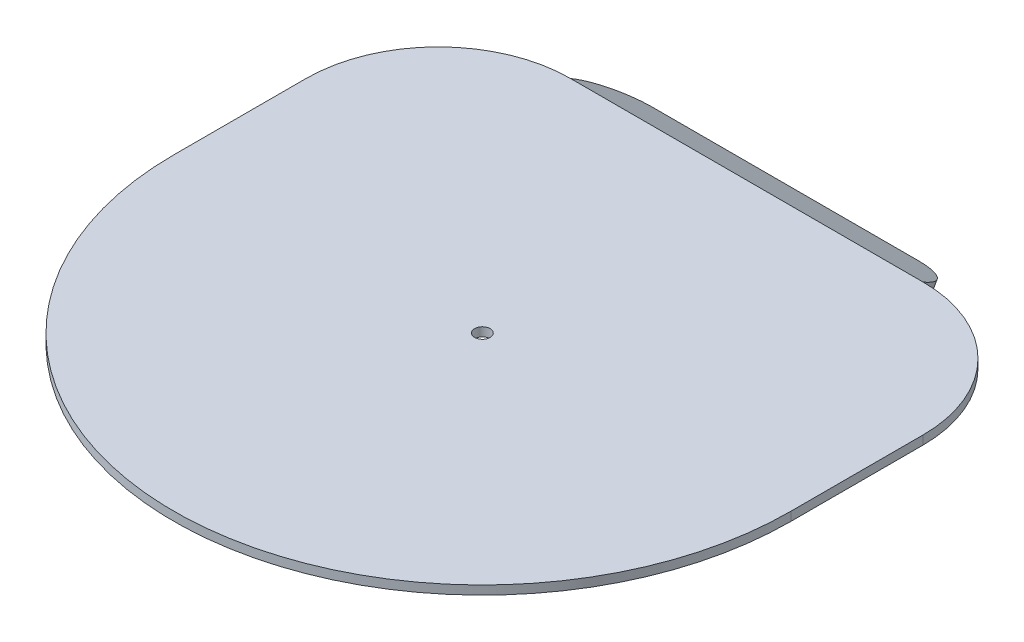
ISO-10303-21;
HEADER;
FILE_DESCRIPTION(('STEP AP214'),'2;1');
FILE_NAME('part.step','',(''),(''),'','','');
FILE_SCHEMA(('AUTOMOTIVE_DESIGN { 1 0 10303 214 1 1 1 1 }'));
ENDSEC;
DATA;
#1=APPLICATION_CONTEXT('core data for automotive mechanical design processes');
#2=APPLICATION_PROTOCOL_DEFINITION('international standard','automotive_design',2000,#1);
#3=PRODUCT_CONTEXT('',#1,'mechanical');
#4=PRODUCT('Part','Part','',(#3));
#5=PRODUCT_RELATED_PRODUCT_CATEGORY('part','',(#4));
#6=PRODUCT_DEFINITION_FORMATION('','',#4);
#7=PRODUCT_DEFINITION_CONTEXT('part definition',#1,'design');
#8=PRODUCT_DEFINITION('design','',#6,#7);
#9=PRODUCT_DEFINITION_SHAPE('','',#8);
#10=(LENGTH_UNIT() NAMED_UNIT(*) SI_UNIT(.MILLI.,.METRE.));
#11=(NAMED_UNIT(*) PLANE_ANGLE_UNIT() SI_UNIT($,.RADIAN.));
#12=(NAMED_UNIT(*) SI_UNIT($,.STERADIAN.) SOLID_ANGLE_UNIT());
#13=UNCERTAINTY_MEASURE_WITH_UNIT(LENGTH_MEASURE(1.E-05),#10,'distance_accuracy_value','');
#14=(GEOMETRIC_REPRESENTATION_CONTEXT(3) GLOBAL_UNCERTAINTY_ASSIGNED_CONTEXT((#13)) GLOBAL_UNIT_ASSIGNED_CONTEXT((#10,
#11,#12)) REPRESENTATION_CONTEXT('',''));
#15=CARTESIAN_POINT('',(0.,0.,0.));
#16=DIRECTION('',(0.,0.,1.));
#17=DIRECTION('',(1.,0.,0.));
#18=AXIS2_PLACEMENT_3D('',#15,#16,#17);
#19=CARTESIAN_POINT('',(40.,2.,-30.));
#20=DIRECTION('',(0.,-1.,0.));
#21=DIRECTION('',(0.,0.,-1.));
#22=AXIS2_PLACEMENT_3D('',#19,#20,#21);
#23=CYLINDRICAL_SURFACE('',#22,30.);
#24=CARTESIAN_POINT('',(40.,0.,-30.));
#25=DIRECTION('',(0.,1.,0.));
#26=DIRECTION('',(0.,0.,-1.));
#27=AXIS2_PLACEMENT_3D('',#24,#25,#26);
#28=CIRCLE('',#27,30.);
#29=CARTESIAN_POINT('',(70.,0.,-30.));
#30=VERTEX_POINT('',#29);
#31=CARTESIAN_POINT('',(39.9498780153371,0.,-59.9999581297483));
#32=VERTEX_POINT('',#31);
#33=EDGE_CURVE('E60',#30,#32,#28,.T.);
#34=ORIENTED_EDGE('',*,*,#33,.T.);
#35=CARTESIAN_POINT('',(40.,1.99999999999999,-60.));
#36=CARTESIAN_POINT('',(39.999961506515,1.47854525931197,-59.9999769553019));
#37=CARTESIAN_POINT('',(39.9898025800449,0.957077808216858,-59.9999990153782));
#38=CARTESIAN_POINT('',(39.9489528441156,-0.0850911635174333,-59.9999697292118));
#39=CARTESIAN_POINT('',(39.9182604228085,-0.605792620811148,-59.999918377206));
#40=CARTESIAN_POINT('',(39.8363586974328,-1.64168453915047,-59.9995798683968));
#41=CARTESIAN_POINT('',(39.7853038854251,-2.15688716354821,-59.9992944704875));
#42=CARTESIAN_POINT('',(39.6621603296286,-3.18478581978548,-59.9981613441634));
#43=CARTESIAN_POINT('',(39.5900714052798,-3.69748183006945,-59.9973136109215));
#44=CARTESIAN_POINT('',(39.4241683640519,-4.71955823831024,-59.9945881490656));
#45=CARTESIAN_POINT('',(39.3303459966717,-5.22893730138839,-59.9927100289224));
#46=CARTESIAN_POINT('',(39.1202008636507,-6.24299037621144,-59.987279925922));
#47=CARTESIAN_POINT('',(39.0038800968857,-6.74766480176884,-59.9837280917261));
#48=CARTESIAN_POINT('',(38.7468753192189,-7.75478168683857,-59.9740979430176));
#49=CARTESIAN_POINT('',(38.6060165503674,-8.25717963330026,-59.9680010352913));
#50=CARTESIAN_POINT('',(38.2994645253832,-9.25445145679135,-59.9521454286119));
#51=CARTESIAN_POINT('',(38.1337629998013,-9.74932276777176,-59.9423855087136));
#52=CARTESIAN_POINT('',(37.955149640235,-10.2395263632546,-59.9302286494134));
#53=B_SPLINE_CURVE_WITH_KNOTS('',3,(#35,#36,#37,#38,#39,#40,#41,#42,#43,#44,#45,#46,#47,#48,#49,
#50,#51,#52),.UNSPECIFIED.,.F.,.F.,(4,2,2,2,2,2,2,2,4),(0.,1.56428596623622,3.12869474094047,
4.68145331124496,6.23422521105292,7.78758754664726,9.34081193672361,10.9055877996525,
12.4708856933261),.UNSPECIFIED.);
#54=CARTESIAN_POINT('',(40.,2.,-60.));
#55=VERTEX_POINT('',#54);
#56=EDGE_CURVE('E11',#32,#55,#53,.F.);
#57=ORIENTED_EDGE('',*,*,#56,.T.);
#58=CARTESIAN_POINT('',(40.,2.,-30.));
#59=DIRECTION('',(0.,1.,0.));
#60=DIRECTION('',(0.,0.,-1.));
#61=AXIS2_PLACEMENT_3D('',#58,#59,#60);
#62=CIRCLE('',#61,30.);
#63=CARTESIAN_POINT('',(70.,2.,-30.));
#64=VERTEX_POINT('',#63);
#65=EDGE_CURVE('E117',#64,#55,#62,.T.);
#66=ORIENTED_EDGE('',*,*,#65,.F.);
#67=DIRECTION('',(0.,-1.,0.));
#68=VECTOR('',#67,1.);
#69=CARTESIAN_POINT('',(70.,2.,-30.));
#70=LINE('',#69,#68);
#71=EDGE_CURVE('E226',#64,#30,#70,.T.);
#72=ORIENTED_EDGE('',*,*,#71,.T.);
#73=EDGE_LOOP('',(#34,#57,#66,#72));
#74=FACE_BOUND('',#73,.T.);
#75=ADVANCED_FACE('F43',(#74),#23,.T.);
#76=CARTESIAN_POINT('',(-40.,2.,-30.));
#77=DIRECTION('',(0.,-1.,0.));
#78=DIRECTION('',(0.,0.,-1.));
#79=AXIS2_PLACEMENT_3D('',#76,#77,#78);
#80=CYLINDRICAL_SURFACE('',#79,30.);
#81=CARTESIAN_POINT('',(-40.,0.,-30.));
#82=DIRECTION('',(0.,1.,0.));
#83=DIRECTION('',(0.,0.,-1.));
#84=AXIS2_PLACEMENT_3D('',#81,#82,#83);
#85=CIRCLE('',#84,30.);
#86=CARTESIAN_POINT('',(-39.9498780153371,0.,-59.9999581297483));
#87=VERTEX_POINT('',#86);
#88=CARTESIAN_POINT('',(-70.,0.,-30.));
#89=VERTEX_POINT('',#88);
#90=EDGE_CURVE('E68',#87,#89,#85,.T.);
#91=ORIENTED_EDGE('',*,*,#90,.T.);
#92=DIRECTION('',(0.,-1.,0.));
#93=VECTOR('',#92,1.);
#94=CARTESIAN_POINT('',(-70.,2.,-30.));
#95=LINE('',#94,#93);
#96=CARTESIAN_POINT('',(-70.,2.,-30.));
#97=VERTEX_POINT('',#96);
#98=EDGE_CURVE('E248',#97,#89,#95,.T.);
#99=ORIENTED_EDGE('',*,*,#98,.F.);
#100=CARTESIAN_POINT('',(-40.,2.,-30.));
#101=DIRECTION('',(0.,1.,0.));
#102=DIRECTION('',(0.,0.,-1.));
#103=AXIS2_PLACEMENT_3D('',#100,#101,#102);
#104=CIRCLE('',#103,30.);
#105=CARTESIAN_POINT('',(-40.,2.,-60.));
#106=VERTEX_POINT('',#105);
#107=EDGE_CURVE('E133',#106,#97,#104,.T.);
#108=ORIENTED_EDGE('',*,*,#107,.F.);
#109=CARTESIAN_POINT('',(-39.9498780153371,0.,-59.9999581297483));
#110=CARTESIAN_POINT('',(-39.9631579032479,0.264356991248656,-59.9999792044114));
#111=CARTESIAN_POINT('',(-39.9737900293745,0.528839174662567,-59.9999894112579));
#112=CARTESIAN_POINT('',(-39.9897803427863,1.05796285693506,-59.9999995294392));
#113=CARTESIAN_POINT('',(-39.9951385329807,1.32260435570568,-59.9999994407798));
#114=CARTESIAN_POINT('',(-40.003334197164,2.11659318568166,-60.000000891643));
#115=CARTESIAN_POINT('',(-39.9982946888179,2.64604330456979,-60.0000041477448));
#116=CARTESIAN_POINT('',(-39.9672662152775,3.70032547567124,-59.9999859697698));
#117=CARTESIAN_POINT('',(-39.9414352708191,4.22516228392922,-59.9999647214084));
#118=CARTESIAN_POINT('',(-39.8686621584244,5.27342251730089,-59.9997347530244));
#119=CARTESIAN_POINT('',(-39.8217184648814,5.79684583752584,-59.9995260194529));
#120=CARTESIAN_POINT('',(-39.7059712961723,6.84153889892198,-59.9986149770913));
#121=CARTESIAN_POINT('',(-39.637156972602,7.36280744100263,-59.9979124231435));
#122=CARTESIAN_POINT('',(-39.4765065745418,8.4017377067457,-59.9955406169536));
#123=CARTESIAN_POINT('',(-39.3846747051033,8.91940007148219,-59.9938715412115));
#124=CARTESIAN_POINT('',(-39.2279090231018,9.69403810860744,-59.990108273214));
#125=CARTESIAN_POINT('',(-39.1722378425236,9.95291405274206,-59.9886359456599));
#126=CARTESIAN_POINT('',(-39.0542709773639,10.4691460309964,-59.9851477355492));
#127=CARTESIAN_POINT('',(-38.9919755411104,10.7265021217104,-59.9831318733641));
#128=CARTESIAN_POINT('',(-38.8603556759017,11.2395681494122,-59.9784184637259));
#129=CARTESIAN_POINT('',(-38.7910272207692,11.4952770533486,-59.9757205244719));
#130=CARTESIAN_POINT('',(-38.6448867327753,12.0045698003699,-59.9694666282306));
#131=CARTESIAN_POINT('',(-38.5680737289667,12.2581533630944,-59.9659105598322));
#132=CARTESIAN_POINT('',(-38.4872851586335,12.5104763735637,-59.9618372902716));
#133=B_SPLINE_CURVE_WITH_KNOTS('',3,(#109,#110,#111,#112,#113,#114,#115,#116,#117,#118,#119,
#120,#121,#122,#123,#124,#125,#126,#127,#128,#129,#130,#131,#132),.UNSPECIFIED.,.F.,.F.,(4,2,2,
2,2,2,2,2,2,2,2,4),(0.,0.794042414901446,1.58808439179831,3.17605292162782,4.75206513742107,
6.32819125410236,7.90510039390599,9.48172165953497,10.276045163004,11.0703388996105,
11.8650899376874,12.6599442139598),.UNSPECIFIED.);
#134=EDGE_CURVE('E161',#106,#87,#133,.F.);
#135=ORIENTED_EDGE('',*,*,#134,.T.);
#136=EDGE_LOOP('',(#91,#99,#108,#135));
#137=FACE_BOUND('',#136,.T.);
#138=ADVANCED_FACE('F174',(#137),#80,.T.);
#139=CARTESIAN_POINT('',(-70.,2.,0.));
#140=DIRECTION('',(1.,0.,0.));
#141=DIRECTION('',(0.,0.,-1.));
#142=AXIS2_PLACEMENT_3D('',#139,#140,#141);
#143=PLANE('',#142);
#144=DIRECTION('',(0.,0.,1.));
#145=VECTOR('',#144,1.);
#146=CARTESIAN_POINT('',(-70.,0.,0.));
#147=LINE('',#146,#145);
#148=CARTESIAN_POINT('',(-70.,0.,0.));
#149=VERTEX_POINT('',#148);
#150=EDGE_CURVE('E230',#89,#149,#147,.T.);
#151=ORIENTED_EDGE('',*,*,#150,.T.);
#152=DIRECTION('',(0.,-1.,0.));
#153=VECTOR('',#152,1.);
#154=CARTESIAN_POINT('',(-70.,2.,0.));
#155=LINE('',#154,#153);
#156=CARTESIAN_POINT('',(-70.,2.,0.));
#157=VERTEX_POINT('',#156);
#158=EDGE_CURVE('E244',#157,#149,#155,.T.);
#159=ORIENTED_EDGE('',*,*,#158,.F.);
#160=DIRECTION('',(0.,0.,1.));
#161=VECTOR('',#160,1.);
#162=CARTESIAN_POINT('',(-70.,2.,0.));
#163=LINE('',#162,#161);
#164=EDGE_CURVE('E219',#97,#157,#163,.T.);
#165=ORIENTED_EDGE('',*,*,#164,.F.);
#166=ORIENTED_EDGE('',*,*,#98,.T.);
#167=EDGE_LOOP('',(#151,#159,#165,#166));
#168=FACE_BOUND('',#167,.T.);
#169=ADVANCED_FACE('F178',(#168),#143,.F.);
#170=CARTESIAN_POINT('',(0.,2.,0.));
#171=DIRECTION('',(0.,-1.,0.));
#172=DIRECTION('',(0.,0.,-1.));
#173=AXIS2_PLACEMENT_3D('',#170,#171,#172);
#174=CYLINDRICAL_SURFACE('',#173,70.);
#175=CARTESIAN_POINT('',(0.,0.,0.));
#176=DIRECTION('',(0.,1.,0.));
#177=DIRECTION('',(0.,0.,1.));
#178=AXIS2_PLACEMENT_3D('',#175,#176,#177);
#179=CIRCLE('',#178,70.);
#180=CARTESIAN_POINT('',(70.,0.,0.));
#181=VERTEX_POINT('',#180);
#182=EDGE_CURVE('E233',#149,#181,#179,.T.);
#183=ORIENTED_EDGE('',*,*,#182,.T.);
#184=DIRECTION('',(0.,-1.,0.));
#185=VECTOR('',#184,1.);
#186=CARTESIAN_POINT('',(70.,2.,0.));
#187=LINE('',#186,#185);
#188=CARTESIAN_POINT('',(70.,2.,0.));
#189=VERTEX_POINT('',#188);
#190=EDGE_CURVE('E240',#189,#181,#187,.T.);
#191=ORIENTED_EDGE('',*,*,#190,.F.);
#192=CARTESIAN_POINT('',(0.,2.,0.));
#193=DIRECTION('',(0.,1.,0.));
#194=DIRECTION('',(0.,0.,1.));
#195=AXIS2_PLACEMENT_3D('',#192,#193,#194);
#196=CIRCLE('',#195,70.);
#197=EDGE_CURVE('E222',#157,#189,#196,.T.);
#198=ORIENTED_EDGE('',*,*,#197,.F.);
#199=ORIENTED_EDGE('',*,*,#158,.T.);
#200=EDGE_LOOP('',(#183,#191,#198,#199));
#201=FACE_BOUND('',#200,.T.);
#202=ADVANCED_FACE('F260',(#201),#174,.T.);
#203=CARTESIAN_POINT('',(70.,2.,-30.));
#204=DIRECTION('',(-1.,0.,0.));
#205=DIRECTION('',(0.,0.,1.));
#206=AXIS2_PLACEMENT_3D('',#203,#204,#205);
#207=PLANE('',#206);
#208=DIRECTION('',(0.,0.,-1.));
#209=VECTOR('',#208,1.);
#210=CARTESIAN_POINT('',(70.,0.,-30.));
#211=LINE('',#210,#209);
#212=EDGE_CURVE('E140',#181,#30,#211,.T.);
#213=ORIENTED_EDGE('',*,*,#212,.T.);
#214=ORIENTED_EDGE('',*,*,#71,.F.);
#215=DIRECTION('',(0.,0.,-1.));
#216=VECTOR('',#215,1.);
#217=CARTESIAN_POINT('',(70.,2.,-30.));
#218=LINE('',#217,#216);
#219=EDGE_CURVE('E137',#189,#64,#218,.T.);
#220=ORIENTED_EDGE('',*,*,#219,.F.);
#221=ORIENTED_EDGE('',*,*,#190,.T.);
#222=EDGE_LOOP('',(#213,#214,#220,#221));
#223=FACE_BOUND('',#222,.T.);
#224=ADVANCED_FACE('F263',(#223),#207,.F.);
#225=CARTESIAN_POINT('',(40.,2.,-30.));
#226=DIRECTION('',(0.,-1.,0.));
#227=DIRECTION('',(0.,0.,-1.));
#228=AXIS2_PLACEMENT_3D('',#225,#226,#227);
#229=PLANE('',#228);
#230=CARTESIAN_POINT('',(0.,2.,0.));
#231=DIRECTION('',(0.,1.,0.));
#232=DIRECTION('',(0.,0.,1.));
#233=AXIS2_PLACEMENT_3D('',#230,#231,#232);
#234=CIRCLE('',#233,1.75);
#235=CARTESIAN_POINT('',(0.,2.,1.75));
#236=VERTEX_POINT('',#235);
#237=EDGE_CURVE('E215',#236,#236,#234,.T.);
#238=ORIENTED_EDGE('',*,*,#237,.F.);
#239=EDGE_LOOP('',(#238));
#240=FACE_BOUND('',#239,.T.);
#241=ORIENTED_EDGE('',*,*,#65,.T.);
#242=DIRECTION('',(-1.,0.,0.));
#243=VECTOR('',#242,1.);
#244=CARTESIAN_POINT('',(-40.,2.,-60.));
#245=LINE('',#244,#243);
#246=EDGE_CURVE('E124',#55,#106,#245,.T.);
#247=ORIENTED_EDGE('',*,*,#246,.T.);
#248=ORIENTED_EDGE('',*,*,#107,.T.);
#249=ORIENTED_EDGE('',*,*,#164,.T.);
#250=ORIENTED_EDGE('',*,*,#197,.T.);
#251=ORIENTED_EDGE('',*,*,#219,.T.);
#252=EDGE_LOOP('',(#241,#247,#248,#249,#250,#251));
#253=FACE_BOUND('',#252,.T.);
#254=ADVANCED_FACE('F135',(#240,#253),#229,.F.);
#255=CARTESIAN_POINT('',(40.,0.,-30.));
#256=DIRECTION('',(0.,-1.,0.));
#257=DIRECTION('',(0.,0.,-1.));
#258=AXIS2_PLACEMENT_3D('',#255,#256,#257);
#259=PLANE('',#258);
#260=CARTESIAN_POINT('',(0.,0.,0.));
#261=DIRECTION('',(0.,-1.,0.));
#262=DIRECTION('',(0.,0.,-1.));
#263=AXIS2_PLACEMENT_3D('',#260,#261,#262);
#264=CIRCLE('',#263,1.75);
#265=CARTESIAN_POINT('',(0.,0.,-1.75));
#266=VERTEX_POINT('',#265);
#267=EDGE_CURVE('E48',#266,#266,#264,.T.);
#268=ORIENTED_EDGE('',*,*,#267,.F.);
#269=EDGE_LOOP('',(#268));
#270=FACE_BOUND('',#269,.T.);
#271=ORIENTED_EDGE('',*,*,#90,.F.);
#272=CARTESIAN_POINT('',(-30.,0.,-58.8452994616208));
#273=DIRECTION('',(0.,-1.,0.));
#274=DIRECTION('',(0.,0.,-1.));
#275=AXIS2_PLACEMENT_3D('',#272,#273,#274);
#276=ELLIPSE('',#275,11.5470053837925,10.);
#277=CARTESIAN_POINT('',(-40.,0.,-58.8452994616208));
#278=VERTEX_POINT('',#277);
#279=EDGE_CURVE('E169',#87,#278,#276,.F.);
#280=ORIENTED_EDGE('',*,*,#279,.T.);
#281=DIRECTION('',(1.,0.,0.));
#282=VECTOR('',#281,1.);
#283=CARTESIAN_POINT('',(-40.,0.,-58.8452994616208));
#284=LINE('',#283,#282);
#285=CARTESIAN_POINT('',(40.,0.,-58.8452994616208));
#286=VERTEX_POINT('',#285);
#287=EDGE_CURVE('E193',#278,#286,#284,.T.);
#288=ORIENTED_EDGE('',*,*,#287,.T.);
#289=CARTESIAN_POINT('',(30.,0.,-58.8452994616208));
#290=DIRECTION('',(0.,-1.,0.));
#291=DIRECTION('',(0.,0.,1.));
#292=AXIS2_PLACEMENT_3D('',#289,#290,#291);
#293=ELLIPSE('',#292,11.5470053837925,10.);
#294=EDGE_CURVE('E54',#286,#32,#293,.F.);
#295=ORIENTED_EDGE('',*,*,#294,.T.);
#296=ORIENTED_EDGE('',*,*,#33,.F.);
#297=ORIENTED_EDGE('',*,*,#212,.F.);
#298=ORIENTED_EDGE('',*,*,#182,.F.);
#299=ORIENTED_EDGE('',*,*,#150,.F.);
#300=EDGE_LOOP('',(#271,#280,#288,#295,#296,#297,#298,#299));
#301=FACE_BOUND('',#300,.T.);
#302=ADVANCED_FACE('F192',(#270,#301),#259,.T.);
#303=CARTESIAN_POINT('',(-40.,2.,-60.));
#304=DIRECTION('',(0.,0.866025403784442,-0.499999999999995));
#305=DIRECTION('',(0.,0.499999999999995,0.866025403784442));
#306=AXIS2_PLACEMENT_3D('',#303,#304,#305);
#307=PLANE('',#306);
#308=DIRECTION('',(1.,0.,0.));
#309=VECTOR('',#308,1.);
#310=CARTESIAN_POINT('',(-40.,-2.99999999999995,-68.6602540378444));
#311=LINE('',#310,#309);
#312=CARTESIAN_POINT('',(-30.,-2.99999999999995,-68.6602540378444));
#313=VERTEX_POINT('',#312);
#314=CARTESIAN_POINT('',(30.,-2.99999999999995,-68.6602540378444));
#315=VERTEX_POINT('',#314);
#316=EDGE_CURVE('E207',#313,#315,#311,.T.);
#317=ORIENTED_EDGE('',*,*,#316,.F.);
#318=CARTESIAN_POINT('',(-30.,2.,-60.));
#319=DIRECTION('',(0.,0.866025403784442,-0.499999999999995));
#320=DIRECTION('',(0.,0.499999999999995,0.866025403784442));
#321=AXIS2_PLACEMENT_3D('',#318,#319,#320);
#322=CIRCLE('',#321,10.);
#323=EDGE_CURVE('E129',#313,#106,#322,.T.);
#324=ORIENTED_EDGE('',*,*,#323,.T.);
#325=ORIENTED_EDGE('',*,*,#246,.F.);
#326=CARTESIAN_POINT('',(30.,1.99999999999999,-60.));
#327=DIRECTION('',(0.,0.866025403784442,-0.499999999999995));
#328=DIRECTION('',(0.,0.499999999999995,0.866025403784442));
#329=AXIS2_PLACEMENT_3D('',#326,#327,#328);
#330=CIRCLE('',#329,10.);
#331=EDGE_CURVE('E127',#55,#315,#330,.T.);
#332=ORIENTED_EDGE('',*,*,#331,.T.);
#333=EDGE_LOOP('',(#317,#324,#325,#332));
#334=FACE_BOUND('',#333,.T.);
#335=ADVANCED_FACE('F126',(#334),#307,.T.);
#336=CARTESIAN_POINT('',(-40.,-2.99999999999995,-68.6602540378444));
#337=DIRECTION('',(0.,-0.499999999999997,-0.866025403784441));
#338=DIRECTION('',(0.,0.866025403784441,-0.499999999999997));
#339=AXIS2_PLACEMENT_3D('',#336,#337,#338);
#340=PLANE('',#339);
#341=DIRECTION('',(1.,0.,0.));
#342=VECTOR('',#341,1.);
#343=CARTESIAN_POINT('',(-40.,-4.99999999999994,-67.5055534994652));
#344=LINE('',#343,#342);
#345=CARTESIAN_POINT('',(-30.,-4.99999999999994,-67.5055534994652));
#346=VERTEX_POINT('',#345);
#347=CARTESIAN_POINT('',(30.,-4.99999999999994,-67.5055534994652));
#348=VERTEX_POINT('',#347);
#349=EDGE_CURVE('E202',#346,#348,#344,.T.);
#350=ORIENTED_EDGE('',*,*,#349,.F.);
#351=DIRECTION('',(0.,0.866025403784441,-0.499999999999997));
#352=VECTOR('',#351,1.);
#353=CARTESIAN_POINT('',(-30.,-2.99999999999995,-68.6602540378444));
#354=LINE('',#353,#352);
#355=EDGE_CURVE('E146',#346,#313,#354,.T.);
#356=ORIENTED_EDGE('',*,*,#355,.T.);
#357=ORIENTED_EDGE('',*,*,#316,.T.);
#358=DIRECTION('',(0.,0.866025403784441,-0.499999999999997));
#359=VECTOR('',#358,1.);
#360=CARTESIAN_POINT('',(30.,-30.480762113533,-52.7942286340602));
#361=LINE('',#360,#359);
#362=EDGE_CURVE('E144',#315,#348,#361,.F.);
#363=ORIENTED_EDGE('',*,*,#362,.T.);
#364=EDGE_LOOP('',(#350,#356,#357,#363));
#365=FACE_BOUND('',#364,.T.);
#366=ADVANCED_FACE('F206',(#365),#340,.T.);
#367=CARTESIAN_POINT('',(-40.,0.,-58.8452994616208));
#368=DIRECTION('',(0.,-0.866025403784442,0.499999999999994));
#369=DIRECTION('',(0.,-0.499999999999995,-0.866025403784442));
#370=AXIS2_PLACEMENT_3D('',#367,#368,#369);
#371=PLANE('',#370);
#372=ORIENTED_EDGE('',*,*,#287,.F.);
#373=CARTESIAN_POINT('',(-30.,0.,-58.8452994616208));
#374=DIRECTION('',(0.,-0.866025403784442,0.499999999999994));
#375=DIRECTION('',(0.,-0.499999999999995,-0.866025403784442));
#376=AXIS2_PLACEMENT_3D('',#373,#374,#375);
#377=CIRCLE('',#376,10.);
#378=EDGE_CURVE('E158',#278,#346,#377,.T.);
#379=ORIENTED_EDGE('',*,*,#378,.T.);
#380=ORIENTED_EDGE('',*,*,#349,.T.);
#381=CARTESIAN_POINT('',(30.,0.,-58.8452994616208));
#382=DIRECTION('',(0.,-0.866025403784442,0.499999999999994));
#383=DIRECTION('',(0.,-0.499999999999995,-0.866025403784442));
#384=AXIS2_PLACEMENT_3D('',#381,#382,#383);
#385=CIRCLE('',#384,10.);
#386=EDGE_CURVE('E150',#348,#286,#385,.T.);
#387=ORIENTED_EDGE('',*,*,#386,.T.);
#388=EDGE_LOOP('',(#372,#379,#380,#387));
#389=FACE_BOUND('',#388,.T.);
#390=ADVANCED_FACE('F198',(#389),#371,.T.);
#391=CARTESIAN_POINT('',(-30.,2.00000000000002,-60.));
#392=DIRECTION('',(0.,0.866025403784441,-0.499999999999997));
#393=DIRECTION('',(0.,0.499999999999997,0.866025403784441));
#394=AXIS2_PLACEMENT_3D('',#391,#392,#393);
#395=CYLINDRICAL_SURFACE('',#394,10.);
#396=ORIENTED_EDGE('',*,*,#279,.F.);
#397=ORIENTED_EDGE('',*,*,#134,.F.);
#398=ORIENTED_EDGE('',*,*,#323,.F.);
#399=ORIENTED_EDGE('',*,*,#355,.F.);
#400=ORIENTED_EDGE('',*,*,#378,.F.);
#401=EDGE_LOOP('',(#396,#397,#398,#399,#400));
#402=FACE_BOUND('',#401,.T.);
#403=ADVANCED_FACE('F171',(#402),#395,.T.);
#404=CARTESIAN_POINT('',(30.,-25.4807621135331,-44.1339745962158));
#405=DIRECTION('',(0.,-0.866025403784441,0.499999999999997));
#406=DIRECTION('',(0.,-0.499999999999997,-0.866025403784441));
#407=AXIS2_PLACEMENT_3D('',#404,#405,#406);
#408=CYLINDRICAL_SURFACE('',#407,10.);
#409=ORIENTED_EDGE('',*,*,#386,.F.);
#410=ORIENTED_EDGE('',*,*,#362,.F.);
#411=ORIENTED_EDGE('',*,*,#331,.F.);
#412=ORIENTED_EDGE('',*,*,#56,.F.);
#413=ORIENTED_EDGE('',*,*,#294,.F.);
#414=EDGE_LOOP('',(#409,#410,#411,#412,#413));
#415=FACE_BOUND('',#414,.T.);
#416=ADVANCED_FACE('F45',(#415),#408,.T.);
#417=CARTESIAN_POINT('',(0.,-8.,0.));
#418=DIRECTION('',(0.,1.,0.));
#419=DIRECTION('',(0.,0.,1.));
#420=AXIS2_PLACEMENT_3D('',#417,#418,#419);
#421=CYLINDRICAL_SURFACE('',#420,1.75);
#422=ORIENTED_EDGE('',*,*,#267,.T.);
#423=EDGE_LOOP('',(#422));
#424=FACE_BOUND('',#423,.T.);
#425=ORIENTED_EDGE('',*,*,#237,.T.);
#426=EDGE_LOOP('',(#425));
#427=FACE_BOUND('',#426,.T.);
#428=ADVANCED_FACE('F282',(#424,#427),#421,.F.);
#429=CLOSED_SHELL('',(#75,#138,#169,#202,#224,#254,#302,#335,#366,#390,#403,#416,#428));
#430=MANIFOLD_SOLID_BREP('B2',#429);
#431=ADVANCED_BREP_SHAPE_REPRESENTATION('',(#18,#430),#14);
#432=SHAPE_DEFINITION_REPRESENTATION(#9,#431);
ENDSEC;
END-ISO-10303-21;
